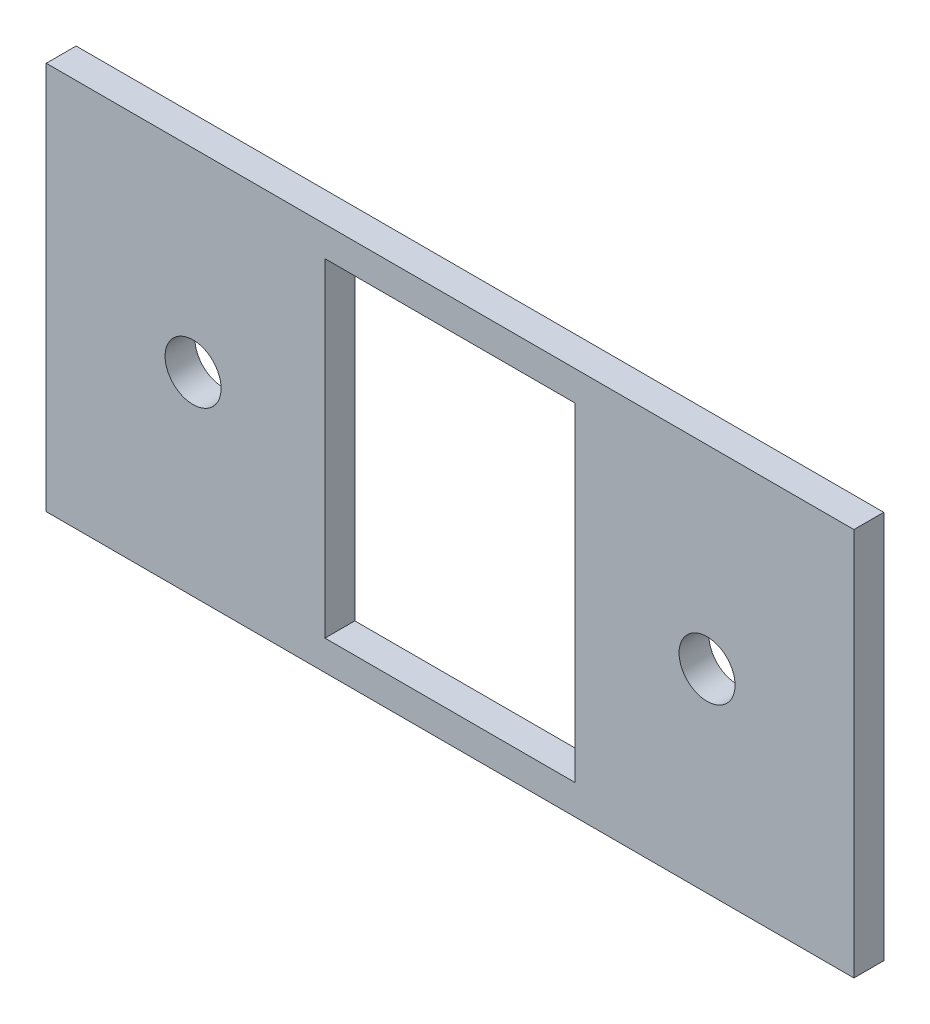
ISO-10303-21;
HEADER;
FILE_DESCRIPTION(('STEP AP214'),'2;1');
FILE_NAME('part.step','',(''),(''),'','','');
FILE_SCHEMA(('AUTOMOTIVE_DESIGN { 1 0 10303 214 1 1 1 1 }'));
ENDSEC;
DATA;
#1=APPLICATION_CONTEXT('core data for automotive mechanical design processes');
#2=APPLICATION_PROTOCOL_DEFINITION('international standard','automotive_design',2000,#1);
#3=PRODUCT_CONTEXT('',#1,'mechanical');
#4=PRODUCT('Part','Part','',(#3));
#5=PRODUCT_RELATED_PRODUCT_CATEGORY('part','',(#4));
#6=PRODUCT_DEFINITION_FORMATION('','',#4);
#7=PRODUCT_DEFINITION_CONTEXT('part definition',#1,'design');
#8=PRODUCT_DEFINITION('design','',#6,#7);
#9=PRODUCT_DEFINITION_SHAPE('','',#8);
#10=(LENGTH_UNIT() NAMED_UNIT(*) SI_UNIT(.MILLI.,.METRE.));
#11=(NAMED_UNIT(*) PLANE_ANGLE_UNIT() SI_UNIT($,.RADIAN.));
#12=(NAMED_UNIT(*) SI_UNIT($,.STERADIAN.) SOLID_ANGLE_UNIT());
#13=UNCERTAINTY_MEASURE_WITH_UNIT(LENGTH_MEASURE(1.E-05),#10,'distance_accuracy_value','');
#14=(GEOMETRIC_REPRESENTATION_CONTEXT(3) GLOBAL_UNCERTAINTY_ASSIGNED_CONTEXT((#13)) GLOBAL_UNIT_ASSIGNED_CONTEXT((#10,
#11,#12)) REPRESENTATION_CONTEXT('',''));
#15=CARTESIAN_POINT('',(0.,0.,0.));
#16=DIRECTION('',(0.,0.,1.));
#17=DIRECTION('',(1.,0.,0.));
#18=AXIS2_PLACEMENT_3D('',#15,#16,#17);
#19=CARTESIAN_POINT('',(-27.035253751749,0.,2.));
#20=DIRECTION('',(0.,0.,1.));
#21=DIRECTION('',(1.,0.,0.));
#22=AXIS2_PLACEMENT_3D('',#19,#20,#21);
#23=PLANE('',#22);
#24=DIRECTION('',(1.,0.,0.));
#25=VECTOR('',#24,1.);
#26=CARTESIAN_POINT('',(-8.37500000000002,2.,2.));
#27=LINE('',#26,#25);
#28=CARTESIAN_POINT('',(-8.37500000000002,2.,2.));
#29=VERTEX_POINT('',#28);
#30=CARTESIAN_POINT('',(8.37499999999998,2.,2.));
#31=VERTEX_POINT('',#30);
#32=EDGE_CURVE('E106',#29,#31,#27,.T.);
#33=ORIENTED_EDGE('',*,*,#32,.F.);
#34=DIRECTION('',(0.,-1.,0.));
#35=VECTOR('',#34,1.);
#36=CARTESIAN_POINT('',(-8.37500000000002,24.,2.));
#37=LINE('',#36,#35);
#38=CARTESIAN_POINT('',(-8.37500000000002,24.,2.));
#39=VERTEX_POINT('',#38);
#40=EDGE_CURVE('E98',#39,#29,#37,.T.);
#41=ORIENTED_EDGE('',*,*,#40,.F.);
#42=DIRECTION('',(-1.,0.,0.));
#43=VECTOR('',#42,1.);
#44=CARTESIAN_POINT('',(8.37499999999998,24.,2.));
#45=LINE('',#44,#43);
#46=CARTESIAN_POINT('',(8.37499999999998,24.,2.));
#47=VERTEX_POINT('',#46);
#48=EDGE_CURVE('E121',#47,#39,#45,.T.);
#49=ORIENTED_EDGE('',*,*,#48,.F.);
#50=DIRECTION('',(0.,1.,0.));
#51=VECTOR('',#50,1.);
#52=CARTESIAN_POINT('',(8.37499999999998,2.,2.));
#53=LINE('',#52,#51);
#54=EDGE_CURVE('E119',#31,#47,#53,.T.);
#55=ORIENTED_EDGE('',*,*,#54,.F.);
#56=EDGE_LOOP('',(#33,#41,#49,#55));
#57=FACE_BOUND('',#56,.T.);
#58=DIRECTION('',(0.,-1.,0.));
#59=VECTOR('',#58,1.);
#60=CARTESIAN_POINT('',(-27.035253751749,26.,2.));
#61=LINE('',#60,#59);
#62=CARTESIAN_POINT('',(-27.035253751749,26.,2.));
#63=VERTEX_POINT('',#62);
#64=CARTESIAN_POINT('',(-27.035253751749,0.,2.));
#65=VERTEX_POINT('',#64);
#66=EDGE_CURVE('E143',#63,#65,#61,.T.);
#67=ORIENTED_EDGE('',*,*,#66,.T.);
#68=DIRECTION('',(1.,0.,0.));
#69=VECTOR('',#68,1.);
#70=CARTESIAN_POINT('',(-27.035253751749,0.,2.));
#71=LINE('',#70,#69);
#72=CARTESIAN_POINT('',(27.035253751749,0.,2.));
#73=VERTEX_POINT('',#72);
#74=EDGE_CURVE('E146',#65,#73,#71,.T.);
#75=ORIENTED_EDGE('',*,*,#74,.T.);
#76=DIRECTION('',(0.,1.,0.));
#77=VECTOR('',#76,1.);
#78=CARTESIAN_POINT('',(27.035253751749,26.,2.));
#79=LINE('',#78,#77);
#80=CARTESIAN_POINT('',(27.035253751749,26.,2.));
#81=VERTEX_POINT('',#80);
#82=EDGE_CURVE('E149',#73,#81,#79,.T.);
#83=ORIENTED_EDGE('',*,*,#82,.T.);
#84=DIRECTION('',(-1.,0.,0.));
#85=VECTOR('',#84,1.);
#86=CARTESIAN_POINT('',(-27.035253751749,26.,2.));
#87=LINE('',#86,#85);
#88=EDGE_CURVE('E151',#81,#63,#87,.T.);
#89=ORIENTED_EDGE('',*,*,#88,.T.);
#90=EDGE_LOOP('',(#67,#75,#83,#89));
#91=FACE_BOUND('',#90,.T.);
#92=CARTESIAN_POINT('',(17.2051268758745,13.,2.));
#93=DIRECTION('',(0.,0.,1.));
#94=DIRECTION('',(-1.,0.,0.));
#95=AXIS2_PLACEMENT_3D('',#92,#93,#94);
#96=CIRCLE('',#95,1.875);
#97=CARTESIAN_POINT('',(15.3301268758745,13.,2.));
#98=VERTEX_POINT('',#97);
#99=EDGE_CURVE('E137',#98,#98,#96,.T.);
#100=ORIENTED_EDGE('',*,*,#99,.F.);
#101=EDGE_LOOP('',(#100));
#102=FACE_BOUND('',#101,.T.);
#103=CARTESIAN_POINT('',(-17.2051268758745,13.,2.));
#104=DIRECTION('',(0.,0.,1.));
#105=DIRECTION('',(1.,0.,0.));
#106=AXIS2_PLACEMENT_3D('',#103,#104,#105);
#107=CIRCLE('',#106,1.875);
#108=CARTESIAN_POINT('',(-15.3301268758745,13.,2.));
#109=VERTEX_POINT('',#108);
#110=EDGE_CURVE('E127',#109,#109,#107,.T.);
#111=ORIENTED_EDGE('',*,*,#110,.F.);
#112=EDGE_LOOP('',(#111));
#113=FACE_BOUND('',#112,.T.);
#114=ADVANCED_FACE('F33',(#57,#91,#102,#113),#23,.T.);
#115=CARTESIAN_POINT('',(-27.035253751749,0.,0.));
#116=DIRECTION('',(0.,0.,1.));
#117=DIRECTION('',(1.,0.,0.));
#118=AXIS2_PLACEMENT_3D('',#115,#116,#117);
#119=PLANE('',#118);
#120=DIRECTION('',(0.,-1.,0.));
#121=VECTOR('',#120,1.);
#122=CARTESIAN_POINT('',(-8.37500000000002,24.,0.));
#123=LINE('',#122,#121);
#124=CARTESIAN_POINT('',(-8.37500000000002,24.,0.));
#125=VERTEX_POINT('',#124);
#126=CARTESIAN_POINT('',(-8.37500000000002,2.,0.));
#127=VERTEX_POINT('',#126);
#128=EDGE_CURVE('E56',#125,#127,#123,.T.);
#129=ORIENTED_EDGE('',*,*,#128,.T.);
#130=DIRECTION('',(1.,0.,0.));
#131=VECTOR('',#130,1.);
#132=CARTESIAN_POINT('',(-8.37500000000002,2.,0.));
#133=LINE('',#132,#131);
#134=CARTESIAN_POINT('',(8.37499999999998,2.,0.));
#135=VERTEX_POINT('',#134);
#136=EDGE_CURVE('E113',#127,#135,#133,.T.);
#137=ORIENTED_EDGE('',*,*,#136,.T.);
#138=DIRECTION('',(0.,1.,0.));
#139=VECTOR('',#138,1.);
#140=CARTESIAN_POINT('',(8.37499999999998,2.,0.));
#141=LINE('',#140,#139);
#142=CARTESIAN_POINT('',(8.37499999999998,24.,0.));
#143=VERTEX_POINT('',#142);
#144=EDGE_CURVE('E129',#135,#143,#141,.T.);
#145=ORIENTED_EDGE('',*,*,#144,.T.);
#146=DIRECTION('',(-1.,0.,0.));
#147=VECTOR('',#146,1.);
#148=CARTESIAN_POINT('',(8.37499999999998,24.,0.));
#149=LINE('',#148,#147);
#150=EDGE_CURVE('E107',#143,#125,#149,.T.);
#151=ORIENTED_EDGE('',*,*,#150,.T.);
#152=EDGE_LOOP('',(#129,#137,#145,#151));
#153=FACE_BOUND('',#152,.T.);
#154=DIRECTION('',(0.,-1.,0.));
#155=VECTOR('',#154,1.);
#156=CARTESIAN_POINT('',(-27.035253751749,26.,0.));
#157=LINE('',#156,#155);
#158=CARTESIAN_POINT('',(-27.035253751749,26.,0.));
#159=VERTEX_POINT('',#158);
#160=CARTESIAN_POINT('',(-27.035253751749,0.,0.));
#161=VERTEX_POINT('',#160);
#162=EDGE_CURVE('E140',#159,#161,#157,.T.);
#163=ORIENTED_EDGE('',*,*,#162,.F.);
#164=DIRECTION('',(-1.,0.,0.));
#165=VECTOR('',#164,1.);
#166=CARTESIAN_POINT('',(-27.035253751749,26.,0.));
#167=LINE('',#166,#165);
#168=CARTESIAN_POINT('',(27.035253751749,26.,0.));
#169=VERTEX_POINT('',#168);
#170=EDGE_CURVE('E147',#169,#159,#167,.T.);
#171=ORIENTED_EDGE('',*,*,#170,.F.);
#172=DIRECTION('',(0.,1.,0.));
#173=VECTOR('',#172,1.);
#174=CARTESIAN_POINT('',(27.035253751749,26.,0.));
#175=LINE('',#174,#173);
#176=CARTESIAN_POINT('',(27.035253751749,0.,0.));
#177=VERTEX_POINT('',#176);
#178=EDGE_CURVE('E158',#177,#169,#175,.T.);
#179=ORIENTED_EDGE('',*,*,#178,.F.);
#180=DIRECTION('',(1.,0.,0.));
#181=VECTOR('',#180,1.);
#182=CARTESIAN_POINT('',(-27.035253751749,0.,0.));
#183=LINE('',#182,#181);
#184=EDGE_CURVE('E156',#161,#177,#183,.T.);
#185=ORIENTED_EDGE('',*,*,#184,.F.);
#186=EDGE_LOOP('',(#163,#171,#179,#185));
#187=FACE_BOUND('',#186,.T.);
#188=CARTESIAN_POINT('',(17.2051268758745,13.,0.));
#189=DIRECTION('',(0.,0.,1.));
#190=DIRECTION('',(-1.,0.,0.));
#191=AXIS2_PLACEMENT_3D('',#188,#189,#190);
#192=CIRCLE('',#191,1.875);
#193=CARTESIAN_POINT('',(15.3301268758745,13.,0.));
#194=VERTEX_POINT('',#193);
#195=EDGE_CURVE('E114',#194,#194,#192,.T.);
#196=ORIENTED_EDGE('',*,*,#195,.T.);
#197=EDGE_LOOP('',(#196));
#198=FACE_BOUND('',#197,.T.);
#199=CARTESIAN_POINT('',(-17.2051268758745,13.,0.));
#200=DIRECTION('',(0.,0.,1.));
#201=DIRECTION('',(1.,0.,0.));
#202=AXIS2_PLACEMENT_3D('',#199,#200,#201);
#203=CIRCLE('',#202,1.875);
#204=CARTESIAN_POINT('',(-15.3301268758745,13.,0.));
#205=VERTEX_POINT('',#204);
#206=EDGE_CURVE('E218',#205,#205,#203,.T.);
#207=ORIENTED_EDGE('',*,*,#206,.T.);
#208=EDGE_LOOP('',(#207));
#209=FACE_BOUND('',#208,.T.);
#210=ADVANCED_FACE('F176',(#153,#187,#198,#209),#119,.F.);
#211=CARTESIAN_POINT('',(-27.035253751749,26.,2.));
#212=DIRECTION('',(1.,0.,0.));
#213=DIRECTION('',(0.,1.,0.));
#214=AXIS2_PLACEMENT_3D('',#211,#212,#213);
#215=PLANE('',#214);
#216=ORIENTED_EDGE('',*,*,#162,.T.);
#217=DIRECTION('',(0.,0.,-1.));
#218=VECTOR('',#217,1.);
#219=CARTESIAN_POINT('',(-27.035253751749,0.,2.));
#220=LINE('',#219,#218);
#221=EDGE_CURVE('E11',#65,#161,#220,.T.);
#222=ORIENTED_EDGE('',*,*,#221,.F.);
#223=ORIENTED_EDGE('',*,*,#66,.F.);
#224=DIRECTION('',(0.,0.,-1.));
#225=VECTOR('',#224,1.);
#226=CARTESIAN_POINT('',(-27.035253751749,26.,2.));
#227=LINE('',#226,#225);
#228=EDGE_CURVE('E153',#63,#159,#227,.T.);
#229=ORIENTED_EDGE('',*,*,#228,.T.);
#230=EDGE_LOOP('',(#216,#222,#223,#229));
#231=FACE_BOUND('',#230,.T.);
#232=ADVANCED_FACE('F35',(#231),#215,.F.);
#233=CARTESIAN_POINT('',(-27.035253751749,0.,2.));
#234=DIRECTION('',(0.,1.,0.));
#235=DIRECTION('',(0.,0.,1.));
#236=AXIS2_PLACEMENT_3D('',#233,#234,#235);
#237=PLANE('',#236);
#238=ORIENTED_EDGE('',*,*,#184,.T.);
#239=DIRECTION('',(0.,0.,-1.));
#240=VECTOR('',#239,1.);
#241=CARTESIAN_POINT('',(27.035253751749,0.,2.));
#242=LINE('',#241,#240);
#243=EDGE_CURVE('E41',#73,#177,#242,.T.);
#244=ORIENTED_EDGE('',*,*,#243,.F.);
#245=ORIENTED_EDGE('',*,*,#74,.F.);
#246=ORIENTED_EDGE('',*,*,#221,.T.);
#247=EDGE_LOOP('',(#238,#244,#245,#246));
#248=FACE_BOUND('',#247,.T.);
#249=ADVANCED_FACE('F186',(#248),#237,.F.);
#250=CARTESIAN_POINT('',(27.035253751749,26.,2.));
#251=DIRECTION('',(-1.,0.,0.));
#252=DIRECTION('',(0.,0.,1.));
#253=AXIS2_PLACEMENT_3D('',#250,#251,#252);
#254=PLANE('',#253);
#255=ORIENTED_EDGE('',*,*,#178,.T.);
#256=DIRECTION('',(0.,0.,-1.));
#257=VECTOR('',#256,1.);
#258=CARTESIAN_POINT('',(27.035253751749,26.,2.));
#259=LINE('',#258,#257);
#260=EDGE_CURVE('E163',#81,#169,#259,.T.);
#261=ORIENTED_EDGE('',*,*,#260,.F.);
#262=ORIENTED_EDGE('',*,*,#82,.F.);
#263=ORIENTED_EDGE('',*,*,#243,.T.);
#264=EDGE_LOOP('',(#255,#261,#262,#263));
#265=FACE_BOUND('',#264,.T.);
#266=ADVANCED_FACE('F170',(#265),#254,.F.);
#267=CARTESIAN_POINT('',(-27.035253751749,26.,2.));
#268=DIRECTION('',(0.,-1.,0.));
#269=DIRECTION('',(0.,0.,-1.));
#270=AXIS2_PLACEMENT_3D('',#267,#268,#269);
#271=PLANE('',#270);
#272=ORIENTED_EDGE('',*,*,#170,.T.);
#273=ORIENTED_EDGE('',*,*,#228,.F.);
#274=ORIENTED_EDGE('',*,*,#88,.F.);
#275=ORIENTED_EDGE('',*,*,#260,.T.);
#276=EDGE_LOOP('',(#272,#273,#274,#275));
#277=FACE_BOUND('',#276,.T.);
#278=ADVANCED_FACE('F180',(#277),#271,.F.);
#279=CARTESIAN_POINT('',(17.2051268758745,13.,2.));
#280=DIRECTION('',(0.,0.,-1.));
#281=DIRECTION('',(-1.,0.,0.));
#282=AXIS2_PLACEMENT_3D('',#279,#280,#281);
#283=CYLINDRICAL_SURFACE('',#282,1.875);
#284=ORIENTED_EDGE('',*,*,#99,.T.);
#285=EDGE_LOOP('',(#284));
#286=FACE_BOUND('',#285,.T.);
#287=ORIENTED_EDGE('',*,*,#195,.F.);
#288=EDGE_LOOP('',(#287));
#289=FACE_BOUND('',#288,.T.);
#290=ADVANCED_FACE('F201',(#286,#289),#283,.F.);
#291=CARTESIAN_POINT('',(-8.37500000000002,24.,2.));
#292=DIRECTION('',(1.,0.,0.));
#293=DIRECTION('',(0.,0.,-1.));
#294=AXIS2_PLACEMENT_3D('',#291,#292,#293);
#295=PLANE('',#294);
#296=ORIENTED_EDGE('',*,*,#128,.F.);
#297=DIRECTION('',(0.,0.,-1.));
#298=VECTOR('',#297,1.);
#299=CARTESIAN_POINT('',(-8.37500000000002,24.,2.));
#300=LINE('',#299,#298);
#301=EDGE_CURVE('E102',#39,#125,#300,.T.);
#302=ORIENTED_EDGE('',*,*,#301,.F.);
#303=ORIENTED_EDGE('',*,*,#40,.T.);
#304=DIRECTION('',(0.,0.,-1.));
#305=VECTOR('',#304,1.);
#306=CARTESIAN_POINT('',(-8.37500000000002,2.,2.));
#307=LINE('',#306,#305);
#308=EDGE_CURVE('E101',#29,#127,#307,.T.);
#309=ORIENTED_EDGE('',*,*,#308,.T.);
#310=EDGE_LOOP('',(#296,#302,#303,#309));
#311=FACE_BOUND('',#310,.T.);
#312=ADVANCED_FACE('F100',(#311),#295,.T.);
#313=CARTESIAN_POINT('',(-8.37500000000002,2.,2.));
#314=DIRECTION('',(0.,1.,0.));
#315=DIRECTION('',(-1.,0.,0.));
#316=AXIS2_PLACEMENT_3D('',#313,#314,#315);
#317=PLANE('',#316);
#318=ORIENTED_EDGE('',*,*,#136,.F.);
#319=ORIENTED_EDGE('',*,*,#308,.F.);
#320=ORIENTED_EDGE('',*,*,#32,.T.);
#321=DIRECTION('',(0.,0.,-1.));
#322=VECTOR('',#321,1.);
#323=CARTESIAN_POINT('',(8.37499999999998,2.,2.));
#324=LINE('',#323,#322);
#325=EDGE_CURVE('E115',#31,#135,#324,.T.);
#326=ORIENTED_EDGE('',*,*,#325,.T.);
#327=EDGE_LOOP('',(#318,#319,#320,#326));
#328=FACE_BOUND('',#327,.T.);
#329=ADVANCED_FACE('F110',(#328),#317,.T.);
#330=CARTESIAN_POINT('',(8.37499999999998,2.,2.));
#331=DIRECTION('',(-1.,0.,0.));
#332=DIRECTION('',(0.,-1.,0.));
#333=AXIS2_PLACEMENT_3D('',#330,#331,#332);
#334=PLANE('',#333);
#335=ORIENTED_EDGE('',*,*,#144,.F.);
#336=ORIENTED_EDGE('',*,*,#325,.F.);
#337=ORIENTED_EDGE('',*,*,#54,.T.);
#338=DIRECTION('',(0.,0.,-1.));
#339=VECTOR('',#338,1.);
#340=CARTESIAN_POINT('',(8.37499999999998,24.,2.));
#341=LINE('',#340,#339);
#342=EDGE_CURVE('E48',#47,#143,#341,.T.);
#343=ORIENTED_EDGE('',*,*,#342,.T.);
#344=EDGE_LOOP('',(#335,#336,#337,#343));
#345=FACE_BOUND('',#344,.T.);
#346=ADVANCED_FACE('F232',(#345),#334,.T.);
#347=CARTESIAN_POINT('',(8.37499999999998,24.,2.));
#348=DIRECTION('',(0.,-1.,0.));
#349=DIRECTION('',(0.,0.,-1.));
#350=AXIS2_PLACEMENT_3D('',#347,#348,#349);
#351=PLANE('',#350);
#352=ORIENTED_EDGE('',*,*,#150,.F.);
#353=ORIENTED_EDGE('',*,*,#342,.F.);
#354=ORIENTED_EDGE('',*,*,#48,.T.);
#355=ORIENTED_EDGE('',*,*,#301,.T.);
#356=EDGE_LOOP('',(#352,#353,#354,#355));
#357=FACE_BOUND('',#356,.T.);
#358=ADVANCED_FACE('F227',(#357),#351,.T.);
#359=CARTESIAN_POINT('',(-17.2051268758745,13.,2.));
#360=DIRECTION('',(0.,0.,-1.));
#361=DIRECTION('',(-1.,0.,0.));
#362=AXIS2_PLACEMENT_3D('',#359,#360,#361);
#363=CYLINDRICAL_SURFACE('',#362,1.875);
#364=ORIENTED_EDGE('',*,*,#110,.T.);
#365=EDGE_LOOP('',(#364));
#366=FACE_BOUND('',#365,.T.);
#367=ORIENTED_EDGE('',*,*,#206,.F.);
#368=EDGE_LOOP('',(#367));
#369=FACE_BOUND('',#368,.T.);
#370=ADVANCED_FACE('F224',(#366,#369),#363,.F.);
#371=CLOSED_SHELL('',(#114,#210,#232,#249,#266,#278,#290,#312,#329,#346,#358,#370));
#372=MANIFOLD_SOLID_BREP('B2',#371);
#373=ADVANCED_BREP_SHAPE_REPRESENTATION('',(#18,#372),#14);
#374=SHAPE_DEFINITION_REPRESENTATION(#9,#373);
ENDSEC;
END-ISO-10303-21;
